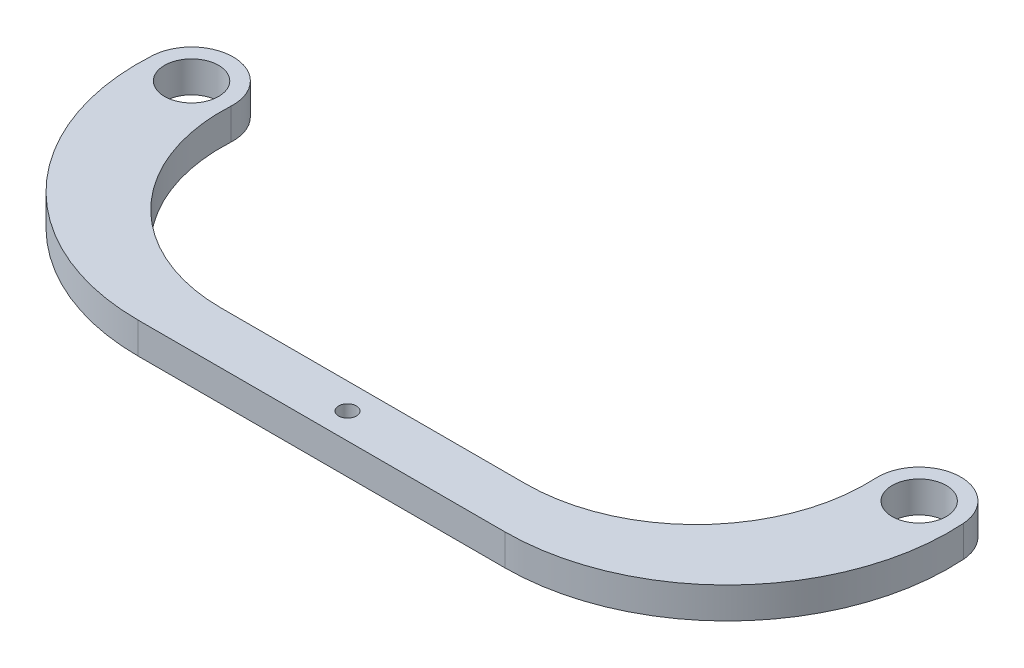
ISO-10303-21;
HEADER;
FILE_DESCRIPTION(('STEP AP214'),'2;1');
FILE_NAME('part.step','',(''),(''),'','','');
FILE_SCHEMA(('AUTOMOTIVE_DESIGN { 1 0 10303 214 1 1 1 1 }'));
ENDSEC;
DATA;
#1=APPLICATION_CONTEXT('core data for automotive mechanical design processes');
#2=APPLICATION_PROTOCOL_DEFINITION('international standard','automotive_design',2000,#1);
#3=PRODUCT_CONTEXT('',#1,'mechanical');
#4=PRODUCT('Part','Part','',(#3));
#5=PRODUCT_RELATED_PRODUCT_CATEGORY('part','',(#4));
#6=PRODUCT_DEFINITION_FORMATION('','',#4);
#7=PRODUCT_DEFINITION_CONTEXT('part definition',#1,'design');
#8=PRODUCT_DEFINITION('design','',#6,#7);
#9=PRODUCT_DEFINITION_SHAPE('','',#8);
#10=(LENGTH_UNIT() NAMED_UNIT(*) SI_UNIT(.MILLI.,.METRE.));
#11=(NAMED_UNIT(*) PLANE_ANGLE_UNIT() SI_UNIT($,.RADIAN.));
#12=(NAMED_UNIT(*) SI_UNIT($,.STERADIAN.) SOLID_ANGLE_UNIT());
#13=UNCERTAINTY_MEASURE_WITH_UNIT(LENGTH_MEASURE(1.E-05),#10,'distance_accuracy_value','');
#14=(GEOMETRIC_REPRESENTATION_CONTEXT(3) GLOBAL_UNCERTAINTY_ASSIGNED_CONTEXT((#13)) GLOBAL_UNIT_ASSIGNED_CONTEXT((#10,
#11,#12)) REPRESENTATION_CONTEXT('',''));
#15=CARTESIAN_POINT('',(0.,0.,0.));
#16=DIRECTION('',(0.,0.,1.));
#17=DIRECTION('',(1.,0.,0.));
#18=AXIS2_PLACEMENT_3D('',#15,#16,#17);
#19=CARTESIAN_POINT('',(0.,3.,2.5));
#20=DIRECTION('',(0.,0.,1.));
#21=DIRECTION('',(1.,0.,0.));
#22=AXIS2_PLACEMENT_3D('',#19,#20,#21);
#23=PLANE('',#22);
#24=DIRECTION('',(-1.,0.,0.));
#25=VECTOR('',#24,1.);
#26=CARTESIAN_POINT('',(0.,0.,2.5));
#27=LINE('',#26,#25);
#28=CARTESIAN_POINT('',(17.6466467056197,0.,2.5));
#29=VERTEX_POINT('',#28);
#30=CARTESIAN_POINT('',(-17.6466467056197,0.,2.5));
#31=VERTEX_POINT('',#30);
#32=EDGE_CURVE('E146',#29,#31,#27,.T.);
#33=ORIENTED_EDGE('',*,*,#32,.F.);
#34=DIRECTION('',(0.,-1.,0.));
#35=VECTOR('',#34,1.);
#36=CARTESIAN_POINT('',(17.6466467056197,3.,2.5));
#37=LINE('',#36,#35);
#38=CARTESIAN_POINT('',(17.6466467056197,3.,2.5));
#39=VERTEX_POINT('',#38);
#40=EDGE_CURVE('E11',#39,#29,#37,.T.);
#41=ORIENTED_EDGE('',*,*,#40,.F.);
#42=DIRECTION('',(-1.,0.,0.));
#43=VECTOR('',#42,1.);
#44=CARTESIAN_POINT('',(0.,3.,2.5));
#45=LINE('',#44,#43);
#46=CARTESIAN_POINT('',(-17.6466467056197,3.,2.5));
#47=VERTEX_POINT('',#46);
#48=EDGE_CURVE('E314',#39,#47,#45,.T.);
#49=ORIENTED_EDGE('',*,*,#48,.T.);
#50=DIRECTION('',(0.,-1.,0.));
#51=VECTOR('',#50,1.);
#52=CARTESIAN_POINT('',(-17.6466467056197,3.,2.5));
#53=LINE('',#52,#51);
#54=EDGE_CURVE('E90',#47,#31,#53,.T.);
#55=ORIENTED_EDGE('',*,*,#54,.T.);
#56=EDGE_LOOP('',(#33,#41,#49,#55));
#57=FACE_BOUND('',#56,.T.);
#58=ADVANCED_FACE('F38',(#57),#23,.T.);
#59=CARTESIAN_POINT('',(17.6466467056197,3.,-18.8888883935022));
#60=DIRECTION('',(0.,-1.,0.));
#61=DIRECTION('',(0.,0.,-1.));
#62=AXIS2_PLACEMENT_3D('',#59,#60,#61);
#63=CYLINDRICAL_SURFACE('',#62,21.3888883935022);
#64=CARTESIAN_POINT('',(17.6466467056197,0.,-18.8888883935022));
#65=DIRECTION('',(0.,1.,0.));
#66=DIRECTION('',(0.,0.,1.));
#67=AXIS2_PLACEMENT_3D('',#64,#65,#66);
#68=CIRCLE('',#67,21.3888883935022);
#69=CARTESIAN_POINT('',(38.9918257916624,0.,-20.2555911755493));
#70=VERTEX_POINT('',#69);
#71=EDGE_CURVE('E148',#29,#70,#68,.T.);
#72=ORIENTED_EDGE('',*,*,#71,.T.);
#73=DIRECTION('',(0.,-1.,0.));
#74=VECTOR('',#73,1.);
#75=CARTESIAN_POINT('',(38.9918257916624,3.,-20.2555911755493));
#76=LINE('',#75,#74);
#77=CARTESIAN_POINT('',(38.9918257916624,3.,-20.2555911755493));
#78=VERTEX_POINT('',#77);
#79=EDGE_CURVE('E47',#78,#70,#76,.T.);
#80=ORIENTED_EDGE('',*,*,#79,.F.);
#81=CARTESIAN_POINT('',(17.6466467056197,3.,-18.8888883935022));
#82=DIRECTION('',(0.,1.,0.));
#83=DIRECTION('',(0.,0.,1.));
#84=AXIS2_PLACEMENT_3D('',#81,#82,#83);
#85=CIRCLE('',#84,21.3888883935022);
#86=EDGE_CURVE('E310',#39,#78,#85,.T.);
#87=ORIENTED_EDGE('',*,*,#86,.F.);
#88=ORIENTED_EDGE('',*,*,#40,.T.);
#89=EDGE_LOOP('',(#72,#80,#87,#88));
#90=FACE_BOUND('',#89,.T.);
#91=ADVANCED_FACE('F180',(#90),#63,.T.);
#92=CARTESIAN_POINT('',(35.,3.,-20.));
#93=DIRECTION('',(0.,-1.,0.));
#94=DIRECTION('',(0.,0.,-1.));
#95=AXIS2_PLACEMENT_3D('',#92,#93,#94);
#96=CYLINDRICAL_SURFACE('',#95,4.);
#97=CARTESIAN_POINT('',(35.,0.,-20.));
#98=DIRECTION('',(0.,1.,0.));
#99=DIRECTION('',(0.,0.,1.));
#100=AXIS2_PLACEMENT_3D('',#97,#98,#99);
#101=CIRCLE('',#100,4.);
#102=CARTESIAN_POINT('',(31.0059440310483,0.,-19.7820162462899));
#103=VERTEX_POINT('',#102);
#104=EDGE_CURVE('E151',#70,#103,#101,.T.);
#105=ORIENTED_EDGE('',*,*,#104,.T.);
#106=DIRECTION('',(0.,-1.,0.));
#107=VECTOR('',#106,1.);
#108=CARTESIAN_POINT('',(31.0059440310483,3.,-19.7820162462899));
#109=LINE('',#108,#107);
#110=CARTESIAN_POINT('',(31.0059440310483,3.,-19.7820162462899));
#111=VERTEX_POINT('',#110);
#112=EDGE_CURVE('E170',#111,#103,#109,.T.);
#113=ORIENTED_EDGE('',*,*,#112,.F.);
#114=CARTESIAN_POINT('',(35.,3.,-20.));
#115=DIRECTION('',(0.,1.,0.));
#116=DIRECTION('',(0.,0.,1.));
#117=AXIS2_PLACEMENT_3D('',#114,#115,#116);
#118=CIRCLE('',#117,4.);
#119=EDGE_CURVE('E176',#78,#111,#118,.T.);
#120=ORIENTED_EDGE('',*,*,#119,.F.);
#121=ORIENTED_EDGE('',*,*,#79,.T.);
#122=EDGE_LOOP('',(#105,#113,#120,#121));
#123=FACE_BOUND('',#122,.T.);
#124=ADVANCED_FACE('F174',(#123),#96,.T.);
#125=CARTESIAN_POINT('',(14.6414096529108,3.,-18.8888883935022));
#126=DIRECTION('',(0.,-1.,0.));
#127=DIRECTION('',(0.,0.,-1.));
#128=AXIS2_PLACEMENT_3D('',#125,#126,#127);
#129=CYLINDRICAL_SURFACE('',#128,16.3888883935022);
#130=CARTESIAN_POINT('',(14.6414096529108,0.,-18.8888883935022));
#131=DIRECTION('',(0.,1.,0.));
#132=DIRECTION('',(0.,0.,1.));
#133=AXIS2_PLACEMENT_3D('',#130,#131,#132);
#134=CIRCLE('',#133,16.3888883935022);
#135=CARTESIAN_POINT('',(14.6414096529108,0.,-2.5));
#136=VERTEX_POINT('',#135);
#137=EDGE_CURVE('E154',#136,#103,#134,.T.);
#138=ORIENTED_EDGE('',*,*,#137,.F.);
#139=DIRECTION('',(0.,-1.,0.));
#140=VECTOR('',#139,1.);
#141=CARTESIAN_POINT('',(14.6414096529108,3.,-2.5));
#142=LINE('',#141,#140);
#143=CARTESIAN_POINT('',(14.6414096529108,3.,-2.5));
#144=VERTEX_POINT('',#143);
#145=EDGE_CURVE('E168',#144,#136,#142,.T.);
#146=ORIENTED_EDGE('',*,*,#145,.F.);
#147=CARTESIAN_POINT('',(14.6414096529108,3.,-18.8888883935022));
#148=DIRECTION('',(0.,1.,0.));
#149=DIRECTION('',(0.,0.,1.));
#150=AXIS2_PLACEMENT_3D('',#147,#148,#149);
#151=CIRCLE('',#150,16.3888883935022);
#152=EDGE_CURVE('E132',#144,#111,#151,.T.);
#153=ORIENTED_EDGE('',*,*,#152,.T.);
#154=ORIENTED_EDGE('',*,*,#112,.T.);
#155=EDGE_LOOP('',(#138,#146,#153,#154));
#156=FACE_BOUND('',#155,.T.);
#157=ADVANCED_FACE('F230',(#156),#129,.F.);
#158=CARTESIAN_POINT('',(0.,3.,-2.5));
#159=DIRECTION('',(0.,0.,1.));
#160=DIRECTION('',(1.,0.,0.));
#161=AXIS2_PLACEMENT_3D('',#158,#159,#160);
#162=PLANE('',#161);
#163=DIRECTION('',(-1.,0.,0.));
#164=VECTOR('',#163,1.);
#165=CARTESIAN_POINT('',(0.,0.,-2.5));
#166=LINE('',#165,#164);
#167=CARTESIAN_POINT('',(-14.6414096529108,0.,-2.5));
#168=VERTEX_POINT('',#167);
#169=EDGE_CURVE('E157',#136,#168,#166,.T.);
#170=ORIENTED_EDGE('',*,*,#169,.T.);
#171=DIRECTION('',(0.,-1.,0.));
#172=VECTOR('',#171,1.);
#173=CARTESIAN_POINT('',(-14.6414096529108,3.,-2.5));
#174=LINE('',#173,#172);
#175=CARTESIAN_POINT('',(-14.6414096529108,3.,-2.5));
#176=VERTEX_POINT('',#175);
#177=EDGE_CURVE('E119',#176,#168,#174,.T.);
#178=ORIENTED_EDGE('',*,*,#177,.F.);
#179=DIRECTION('',(-1.,0.,0.));
#180=VECTOR('',#179,1.);
#181=CARTESIAN_POINT('',(0.,3.,-2.5));
#182=LINE('',#181,#180);
#183=EDGE_CURVE('E129',#144,#176,#182,.T.);
#184=ORIENTED_EDGE('',*,*,#183,.F.);
#185=ORIENTED_EDGE('',*,*,#145,.T.);
#186=EDGE_LOOP('',(#170,#178,#184,#185));
#187=FACE_BOUND('',#186,.T.);
#188=ADVANCED_FACE('F227',(#187),#162,.F.);
#189=CARTESIAN_POINT('',(-14.6414096529108,3.,-18.8888883935022));
#190=DIRECTION('',(0.,-1.,0.));
#191=DIRECTION('',(0.,0.,-1.));
#192=AXIS2_PLACEMENT_3D('',#189,#190,#191);
#193=CYLINDRICAL_SURFACE('',#192,16.3888883935022);
#194=CARTESIAN_POINT('',(-14.6414096529108,0.,-18.8888883935022));
#195=DIRECTION('',(0.,1.,0.));
#196=DIRECTION('',(0.,0.,1.));
#197=AXIS2_PLACEMENT_3D('',#194,#195,#196);
#198=CIRCLE('',#197,16.3888883935022);
#199=CARTESIAN_POINT('',(-31.0059440310483,0.,-19.7820162462899));
#200=VERTEX_POINT('',#199);
#201=EDGE_CURVE('E116',#200,#168,#198,.T.);
#202=ORIENTED_EDGE('',*,*,#201,.F.);
#203=DIRECTION('',(0.,-1.,0.));
#204=VECTOR('',#203,1.);
#205=CARTESIAN_POINT('',(-31.0059440310483,3.,-19.7820162462899));
#206=LINE('',#205,#204);
#207=CARTESIAN_POINT('',(-31.0059440310483,3.,-19.7820162462899));
#208=VERTEX_POINT('',#207);
#209=EDGE_CURVE('E110',#208,#200,#206,.T.);
#210=ORIENTED_EDGE('',*,*,#209,.F.);
#211=CARTESIAN_POINT('',(-14.6414096529108,3.,-18.8888883935022));
#212=DIRECTION('',(0.,1.,0.));
#213=DIRECTION('',(0.,0.,1.));
#214=AXIS2_PLACEMENT_3D('',#211,#212,#213);
#215=CIRCLE('',#214,16.3888883935022);
#216=EDGE_CURVE('E114',#208,#176,#215,.T.);
#217=ORIENTED_EDGE('',*,*,#216,.T.);
#218=ORIENTED_EDGE('',*,*,#177,.T.);
#219=EDGE_LOOP('',(#202,#210,#217,#218));
#220=FACE_BOUND('',#219,.T.);
#221=ADVANCED_FACE('F112',(#220),#193,.F.);
#222=CARTESIAN_POINT('',(-35.,3.,-20.));
#223=DIRECTION('',(0.,-1.,0.));
#224=DIRECTION('',(0.,0.,-1.));
#225=AXIS2_PLACEMENT_3D('',#222,#223,#224);
#226=CYLINDRICAL_SURFACE('',#225,4.);
#227=CARTESIAN_POINT('',(-35.,0.,-20.));
#228=DIRECTION('',(0.,1.,0.));
#229=DIRECTION('',(0.,0.,1.));
#230=AXIS2_PLACEMENT_3D('',#227,#228,#229);
#231=CIRCLE('',#230,4.);
#232=CARTESIAN_POINT('',(-38.9918257916624,0.,-20.2555911755493));
#233=VERTEX_POINT('',#232);
#234=EDGE_CURVE('E161',#200,#233,#231,.T.);
#235=ORIENTED_EDGE('',*,*,#234,.T.);
#236=DIRECTION('',(0.,-1.,0.));
#237=VECTOR('',#236,1.);
#238=CARTESIAN_POINT('',(-38.9918257916624,3.,-20.2555911755493));
#239=LINE('',#238,#237);
#240=CARTESIAN_POINT('',(-38.9918257916624,3.,-20.2555911755493));
#241=VERTEX_POINT('',#240);
#242=EDGE_CURVE('E120',#241,#233,#239,.T.);
#243=ORIENTED_EDGE('',*,*,#242,.F.);
#244=CARTESIAN_POINT('',(-35.,3.,-20.));
#245=DIRECTION('',(0.,1.,0.));
#246=DIRECTION('',(0.,0.,1.));
#247=AXIS2_PLACEMENT_3D('',#244,#245,#246);
#248=CIRCLE('',#247,4.);
#249=EDGE_CURVE('E123',#208,#241,#248,.T.);
#250=ORIENTED_EDGE('',*,*,#249,.F.);
#251=ORIENTED_EDGE('',*,*,#209,.T.);
#252=EDGE_LOOP('',(#235,#243,#250,#251));
#253=FACE_BOUND('',#252,.T.);
#254=ADVANCED_FACE('F124',(#253),#226,.T.);
#255=CARTESIAN_POINT('',(0.,3.,0.));
#256=DIRECTION('',(0.,-1.,0.));
#257=DIRECTION('',(0.,0.,-1.));
#258=AXIS2_PLACEMENT_3D('',#255,#256,#257);
#259=CYLINDRICAL_SURFACE('',#258,0.850000000000001);
#260=CARTESIAN_POINT('',(0.,3.,0.));
#261=DIRECTION('',(0.,1.,0.));
#262=DIRECTION('',(0.,0.,1.));
#263=AXIS2_PLACEMENT_3D('',#260,#261,#262);
#264=CIRCLE('',#263,0.850000000000001);
#265=CARTESIAN_POINT('',(0.,3.,0.850000000000001));
#266=VERTEX_POINT('',#265);
#267=EDGE_CURVE('E316',#266,#266,#264,.T.);
#268=ORIENTED_EDGE('',*,*,#267,.T.);
#269=EDGE_LOOP('',(#268));
#270=FACE_BOUND('',#269,.T.);
#271=CARTESIAN_POINT('',(0.,0.,0.));
#272=DIRECTION('',(0.,1.,0.));
#273=DIRECTION('',(0.,0.,1.));
#274=AXIS2_PLACEMENT_3D('',#271,#272,#273);
#275=CIRCLE('',#274,0.850000000000001);
#276=CARTESIAN_POINT('',(0.,0.,0.850000000000001));
#277=VERTEX_POINT('',#276);
#278=EDGE_CURVE('E143',#277,#277,#275,.T.);
#279=ORIENTED_EDGE('',*,*,#278,.F.);
#280=EDGE_LOOP('',(#279));
#281=FACE_BOUND('',#280,.T.);
#282=ADVANCED_FACE('F190',(#270,#281),#259,.F.);
#283=CARTESIAN_POINT('',(35.,3.,-20.));
#284=DIRECTION('',(0.,-1.,0.));
#285=DIRECTION('',(0.,0.,-1.));
#286=AXIS2_PLACEMENT_3D('',#283,#284,#285);
#287=CYLINDRICAL_SURFACE('',#286,2.6);
#288=CARTESIAN_POINT('',(35.,3.,-20.));
#289=DIRECTION('',(0.,1.,0.));
#290=DIRECTION('',(0.,0.,1.));
#291=AXIS2_PLACEMENT_3D('',#288,#289,#290);
#292=CIRCLE('',#291,2.6);
#293=CARTESIAN_POINT('',(35.,3.,-17.4));
#294=VERTEX_POINT('',#293);
#295=EDGE_CURVE('E204',#294,#294,#292,.T.);
#296=ORIENTED_EDGE('',*,*,#295,.T.);
#297=EDGE_LOOP('',(#296));
#298=FACE_BOUND('',#297,.T.);
#299=CARTESIAN_POINT('',(35.,0.,-20.));
#300=DIRECTION('',(0.,1.,0.));
#301=DIRECTION('',(0.,0.,1.));
#302=AXIS2_PLACEMENT_3D('',#299,#300,#301);
#303=CIRCLE('',#302,2.6);
#304=CARTESIAN_POINT('',(35.,0.,-17.4));
#305=VERTEX_POINT('',#304);
#306=EDGE_CURVE('E140',#305,#305,#303,.T.);
#307=ORIENTED_EDGE('',*,*,#306,.F.);
#308=EDGE_LOOP('',(#307));
#309=FACE_BOUND('',#308,.T.);
#310=ADVANCED_FACE('F192',(#298,#309),#287,.F.);
#311=CARTESIAN_POINT('',(-35.,3.,-20.));
#312=DIRECTION('',(0.,-1.,0.));
#313=DIRECTION('',(0.,0.,-1.));
#314=AXIS2_PLACEMENT_3D('',#311,#312,#313);
#315=CYLINDRICAL_SURFACE('',#314,2.6);
#316=CARTESIAN_POINT('',(-35.,3.,-20.));
#317=DIRECTION('',(0.,1.,0.));
#318=DIRECTION('',(0.,0.,1.));
#319=AXIS2_PLACEMENT_3D('',#316,#317,#318);
#320=CIRCLE('',#319,2.6);
#321=CARTESIAN_POINT('',(-35.,3.,-17.4));
#322=VERTEX_POINT('',#321);
#323=EDGE_CURVE('E164',#322,#322,#320,.F.);
#324=ORIENTED_EDGE('',*,*,#323,.F.);
#325=EDGE_LOOP('',(#324));
#326=FACE_BOUND('',#325,.T.);
#327=CARTESIAN_POINT('',(-35.,0.,-20.));
#328=DIRECTION('',(0.,1.,0.));
#329=DIRECTION('',(0.,0.,1.));
#330=AXIS2_PLACEMENT_3D('',#327,#328,#329);
#331=CIRCLE('',#330,2.6);
#332=CARTESIAN_POINT('',(-35.,0.,-17.4));
#333=VERTEX_POINT('',#332);
#334=EDGE_CURVE('E137',#333,#333,#331,.F.);
#335=ORIENTED_EDGE('',*,*,#334,.T.);
#336=EDGE_LOOP('',(#335));
#337=FACE_BOUND('',#336,.T.);
#338=ADVANCED_FACE('F40',(#326,#337),#315,.F.);
#339=CARTESIAN_POINT('',(-17.6466467056197,3.,-18.8888883935022));
#340=DIRECTION('',(0.,-1.,0.));
#341=DIRECTION('',(0.,0.,-1.));
#342=AXIS2_PLACEMENT_3D('',#339,#340,#341);
#343=CYLINDRICAL_SURFACE('',#342,21.3888883935022);
#344=CARTESIAN_POINT('',(-17.6466467056197,0.,-18.8888883935022));
#345=DIRECTION('',(0.,1.,0.));
#346=DIRECTION('',(0.,0.,1.));
#347=AXIS2_PLACEMENT_3D('',#344,#345,#346);
#348=CIRCLE('',#347,21.3888883935022);
#349=EDGE_CURVE('E83',#233,#31,#348,.T.);
#350=ORIENTED_EDGE('',*,*,#349,.T.);
#351=ORIENTED_EDGE('',*,*,#54,.F.);
#352=CARTESIAN_POINT('',(-17.6466467056197,3.,-18.8888883935022));
#353=DIRECTION('',(0.,1.,0.));
#354=DIRECTION('',(0.,0.,1.));
#355=AXIS2_PLACEMENT_3D('',#352,#353,#354);
#356=CIRCLE('',#355,21.3888883935022);
#357=EDGE_CURVE('E55',#241,#47,#356,.T.);
#358=ORIENTED_EDGE('',*,*,#357,.F.);
#359=ORIENTED_EDGE('',*,*,#242,.T.);
#360=EDGE_LOOP('',(#350,#351,#358,#359));
#361=FACE_BOUND('',#360,.T.);
#362=ADVANCED_FACE('F199',(#361),#343,.T.);
#363=CARTESIAN_POINT('',(0.,3.,0.));
#364=DIRECTION('',(0.,1.,0.));
#365=DIRECTION('',(0.,0.,1.));
#366=AXIS2_PLACEMENT_3D('',#363,#364,#365);
#367=PLANE('',#366);
#368=ORIENTED_EDGE('',*,*,#323,.T.);
#369=EDGE_LOOP('',(#368));
#370=FACE_BOUND('',#369,.T.);
#371=ORIENTED_EDGE('',*,*,#295,.F.);
#372=EDGE_LOOP('',(#371));
#373=FACE_BOUND('',#372,.T.);
#374=ORIENTED_EDGE('',*,*,#267,.F.);
#375=EDGE_LOOP('',(#374));
#376=FACE_BOUND('',#375,.T.);
#377=ORIENTED_EDGE('',*,*,#48,.F.);
#378=ORIENTED_EDGE('',*,*,#86,.T.);
#379=ORIENTED_EDGE('',*,*,#119,.T.);
#380=ORIENTED_EDGE('',*,*,#152,.F.);
#381=ORIENTED_EDGE('',*,*,#183,.T.);
#382=ORIENTED_EDGE('',*,*,#216,.F.);
#383=ORIENTED_EDGE('',*,*,#249,.T.);
#384=ORIENTED_EDGE('',*,*,#357,.T.);
#385=EDGE_LOOP('',(#377,#378,#379,#380,#381,#382,#383,#384));
#386=FACE_BOUND('',#385,.T.);
#387=ADVANCED_FACE('F126',(#370,#373,#376,#386),#367,.T.);
#388=CARTESIAN_POINT('',(0.,0.,0.));
#389=DIRECTION('',(0.,1.,0.));
#390=DIRECTION('',(0.,0.,1.));
#391=AXIS2_PLACEMENT_3D('',#388,#389,#390);
#392=PLANE('',#391);
#393=ORIENTED_EDGE('',*,*,#334,.F.);
#394=EDGE_LOOP('',(#393));
#395=FACE_BOUND('',#394,.T.);
#396=ORIENTED_EDGE('',*,*,#306,.T.);
#397=EDGE_LOOP('',(#396));
#398=FACE_BOUND('',#397,.T.);
#399=ORIENTED_EDGE('',*,*,#278,.T.);
#400=EDGE_LOOP('',(#399));
#401=FACE_BOUND('',#400,.T.);
#402=ORIENTED_EDGE('',*,*,#32,.T.);
#403=ORIENTED_EDGE('',*,*,#349,.F.);
#404=ORIENTED_EDGE('',*,*,#234,.F.);
#405=ORIENTED_EDGE('',*,*,#201,.T.);
#406=ORIENTED_EDGE('',*,*,#169,.F.);
#407=ORIENTED_EDGE('',*,*,#137,.T.);
#408=ORIENTED_EDGE('',*,*,#104,.F.);
#409=ORIENTED_EDGE('',*,*,#71,.F.);
#410=EDGE_LOOP('',(#402,#403,#404,#405,#406,#407,#408,#409));
#411=FACE_BOUND('',#410,.T.);
#412=ADVANCED_FACE('F181',(#395,#398,#401,#411),#392,.F.);
#413=CLOSED_SHELL('',(#58,#91,#124,#157,#188,#221,#254,#282,#310,#338,#362,#387,#412));
#414=MANIFOLD_SOLID_BREP('B2',#413);
#415=ADVANCED_BREP_SHAPE_REPRESENTATION('',(#18,#414),#14);
#416=SHAPE_DEFINITION_REPRESENTATION(#9,#415);
ENDSEC;
END-ISO-10303-21;
